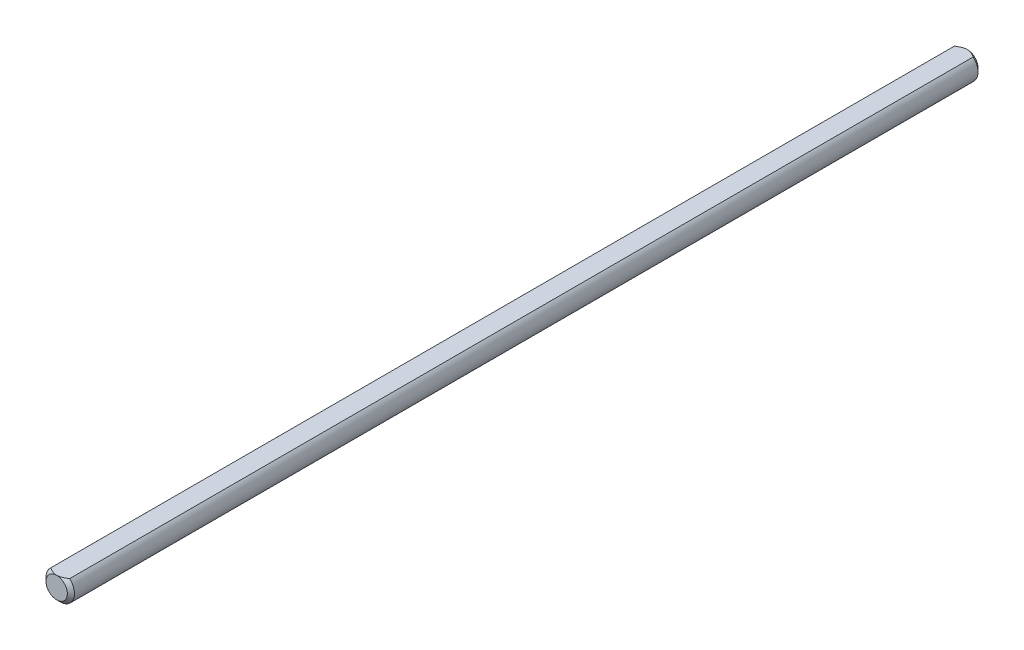
ISO-10303-21;
HEADER;
FILE_DESCRIPTION(('STEP AP214'),'2;1');
FILE_NAME('part.step','',(''),(''),'','','');
FILE_SCHEMA(('AUTOMOTIVE_DESIGN { 1 0 10303 214 1 1 1 1 }'));
ENDSEC;
DATA;
#1=APPLICATION_CONTEXT('core data for automotive mechanical design processes');
#2=APPLICATION_PROTOCOL_DEFINITION('international standard','automotive_design',2000,#1);
#3=PRODUCT_CONTEXT('',#1,'mechanical');
#4=PRODUCT('Part','Part','',(#3));
#5=PRODUCT_RELATED_PRODUCT_CATEGORY('part','',(#4));
#6=PRODUCT_DEFINITION_FORMATION('','',#4);
#7=PRODUCT_DEFINITION_CONTEXT('part definition',#1,'design');
#8=PRODUCT_DEFINITION('design','',#6,#7);
#9=PRODUCT_DEFINITION_SHAPE('','',#8);
#10=(LENGTH_UNIT() NAMED_UNIT(*) SI_UNIT(.MILLI.,.METRE.));
#11=(NAMED_UNIT(*) PLANE_ANGLE_UNIT() SI_UNIT($,.RADIAN.));
#12=(NAMED_UNIT(*) SI_UNIT($,.STERADIAN.) SOLID_ANGLE_UNIT());
#13=UNCERTAINTY_MEASURE_WITH_UNIT(LENGTH_MEASURE(1.E-05),#10,'distance_accuracy_value','');
#14=(GEOMETRIC_REPRESENTATION_CONTEXT(3) GLOBAL_UNCERTAINTY_ASSIGNED_CONTEXT((#13)) GLOBAL_UNIT_ASSIGNED_CONTEXT((#10,
#11,#12)) REPRESENTATION_CONTEXT('',''));
#15=CARTESIAN_POINT('',(0.,0.,0.));
#16=DIRECTION('',(0.,0.,1.));
#17=DIRECTION('',(1.,0.,0.));
#18=AXIS2_PLACEMENT_3D('',#15,#16,#17);
#19=CARTESIAN_POINT('',(0.,0.,64.));
#20=DIRECTION('',(0.,0.,1.));
#21=DIRECTION('',(1.,0.,0.));
#22=AXIS2_PLACEMENT_3D('',#19,#20,#21);
#23=PLANE('',#22);
#24=CARTESIAN_POINT('',(0.,0.,64.0000000000782));
#25=DIRECTION('',(0.,0.,-1.));
#26=DIRECTION('',(-1.,0.,0.));
#27=AXIS2_PLACEMENT_3D('',#24,#25,#26);
#28=CIRCLE('',#27,1.49999999996453);
#29=CARTESIAN_POINT('',(0.,1.49999999998227,64.0000000000605));
#30=VERTEX_POINT('',#29);
#31=EDGE_CURVE('E56',#30,#30,#28,.T.);
#32=ORIENTED_EDGE('',*,*,#31,.F.);
#33=EDGE_LOOP('',(#32));
#34=FACE_BOUND('',#33,.T.);
#35=ADVANCED_FACE('F23',(#34),#23,.T.);
#36=CARTESIAN_POINT('',(2.5,1.5,64.));
#37=DIRECTION('',(0.,-1.,0.));
#38=DIRECTION('',(1.,0.,0.));
#39=AXIS2_PLACEMENT_3D('',#36,#37,#38);
#40=PLANE('',#39);
#41=CARTESIAN_POINT('',(-1.32287565551578,1.49999999999738,-63.4999999999951));
#42=CARTESIAN_POINT('',(-1.28978652610646,1.49999999999903,-63.5218833857498));
#43=CARTESIAN_POINT('',(-1.25648829908703,1.49999999999974,-63.5434496498503));
#44=CARTESIAN_POINT('',(-1.18940821725078,1.50000000000027,-63.5858385594043));
#45=CARTESIAN_POINT('',(-1.15562621828719,1.50000000000009,-63.6066609764761));
#46=CARTESIAN_POINT('',(-1.05313237354557,1.49999999999981,-63.6680407619906));
#47=CARTESIAN_POINT('',(-0.983616016069132,1.49999999999995,-63.7072803573657));
#48=CARTESIAN_POINT('',(-0.844330882577105,1.50000000000005,-63.7796887527494));
#49=CARTESIAN_POINT('',(-0.774644168930951,1.50000000000001,-63.8130137248753));
#50=CARTESIAN_POINT('',(-0.63266148717882,1.49999999999999,-63.8733011447108));
#51=CARTESIAN_POINT('',(-0.560371516971381,1.5,-63.9002772585493));
#52=CARTESIAN_POINT('',(-0.447711355255382,1.5,-63.935050659113));
#53=CARTESIAN_POINT('',(-0.408281760393348,1.5,-63.945907415238));
#54=CARTESIAN_POINT('',(-0.328766084068122,1.5,-63.964879169649));
#55=CARTESIAN_POINT('',(-0.288680112515208,1.5,-63.9729946221418));
#56=CARTESIAN_POINT('',(-0.207337040739238,1.5,-63.9862763839511));
#57=CARTESIAN_POINT('',(-0.166071526804011,1.5,-63.9913918975337));
#58=CARTESIAN_POINT('',(-0.0832091080286585,1.5,-63.9982691223358));
#59=CARTESIAN_POINT('',(-0.0416118354953257,1.5,-64.0000263648933));
#60=CARTESIAN_POINT('',(-3.55771080674516E-13,1.5,-63.9999999999859));
#61=B_SPLINE_CURVE_WITH_KNOTS('',3,(#41,#42,#43,#44,#45,#46,#47,#48,#49,#50,#51,#52,#53,#54,#55,
#56,#57,#58,#59,#60),.UNSPECIFIED.,.F.,.F.,(4,2,2,2,2,2,2,2,2,4),(0.,0.119008015792597,
0.238052261697543,0.477379838947754,0.708907622242699,0.939932380506549,1.06254219803365,
1.18513169035164,1.30974106782519,1.43451614084083),.UNSPECIFIED.);
#62=CARTESIAN_POINT('',(-1.32287565549662,1.49999999999994,-63.5000000000332));
#63=VERTEX_POINT('',#62);
#64=CARTESIAN_POINT('',(0.,1.49999999998227,-64.0000000000036));
#65=VERTEX_POINT('',#64);
#66=EDGE_CURVE('E78',#63,#65,#61,.T.);
#67=ORIENTED_EDGE('',*,*,#66,.F.);
#68=DIRECTION('',(0.,0.,-1.));
#69=VECTOR('',#68,1.);
#70=CARTESIAN_POINT('',(-1.32287565553244,1.49999999999987,64.));
#71=LINE('',#70,#69);
#72=CARTESIAN_POINT('',(-1.32287565553959,1.49999999999994,63.500000000038));
#73=VERTEX_POINT('',#72);
#74=EDGE_CURVE('E61',#73,#63,#71,.T.);
#75=ORIENTED_EDGE('',*,*,#74,.F.);
#76=CARTESIAN_POINT('',(0.,1.5,64.0000000000427));
#77=CARTESIAN_POINT('',(-0.0461370153411529,1.5,64.0000386607632));
#78=CARTESIAN_POINT('',(-0.0922502054811612,1.5,63.9978722597996));
#79=CARTESIAN_POINT('',(-0.184012446607617,1.5,63.9894344398421));
#80=CARTESIAN_POINT('',(-0.229662229086193,1.5,63.9831710594516));
#81=CARTESIAN_POINT('',(-0.319483789254829,1.5,63.9669828571559));
#82=CARTESIAN_POINT('',(-0.363667480994457,1.5,63.9571229727286));
#83=CARTESIAN_POINT('',(-0.451194895226762,1.5,63.9341794397879));
#84=CARTESIAN_POINT('',(-0.494538298889039,1.5,63.9210945924866));
#85=CARTESIAN_POINT('',(-0.606395493958874,1.5,63.8833699128945));
#86=CARTESIAN_POINT('',(-0.674171065763848,1.5,63.8565447061939));
#87=CARTESIAN_POINT('',(-0.807413522300434,1.5,63.7975484095266));
#88=CARTESIAN_POINT('',(-0.87287679301136,1.5,63.7653693642463));
#89=CARTESIAN_POINT('',(-1.00366784629155,1.5,63.6960693225786));
#90=CARTESIAN_POINT('',(-1.06893080510649,1.5,63.6588276799585));
#91=CARTESIAN_POINT('',(-1.19733148576887,1.5,63.581392511705));
#92=CARTESIAN_POINT('',(-1.26047673772965,1.5,63.5412115385651));
#93=CARTESIAN_POINT('',(-1.32287565554666,1.5,63.5000000000333));
#94=B_SPLINE_CURVE_WITH_KNOTS('',3,(#76,#77,#78,#79,#80,#81,#82,#83,#84,#85,#86,#87,#88,#89,#90,
#91,#92,#93),.UNSPECIFIED.,.F.,.F.,(4,2,2,2,2,2,2,2,4),(0.,0.138322115291917,0.276373642272281,
0.412046847194119,0.547770561022349,0.76610941507743,0.984775646603529,1.21010028780345,
1.43451329840714),.UNSPECIFIED.);
#95=EDGE_CURVE('E26',#30,#73,#94,.T.);
#96=ORIENTED_EDGE('',*,*,#95,.F.);
#97=CARTESIAN_POINT('',(1.32287565554652,1.5,63.5000000000333));
#98=CARTESIAN_POINT('',(1.28978652613576,1.5,63.5218833857882));
#99=CARTESIAN_POINT('',(1.25648829911515,1.5,63.5434496498893));
#100=CARTESIAN_POINT('',(1.18940821727678,1.5,63.5858385594449));
#101=CARTESIAN_POINT('',(1.15562621831225,1.5,63.6066609765176));
#102=CARTESIAN_POINT('',(1.05313237356768,1.5,63.6680407620349));
#103=CARTESIAN_POINT('',(0.983616016089106,1.5,63.7072803574117));
#104=CARTESIAN_POINT('',(0.844330882592869,1.5,63.7796887527985));
#105=CARTESIAN_POINT('',(0.774644168944643,1.5,63.8130137249259));
#106=CARTESIAN_POINT('',(0.632661487188201,1.5,63.8733011447641));
#107=CARTESIAN_POINT('',(0.560371516978525,1.5,63.9002772586038));
#108=CARTESIAN_POINT('',(0.447711355259808,1.5,63.9350506591685));
#109=CARTESIAN_POINT('',(0.408281760397369,1.5,63.9459074152938));
#110=CARTESIAN_POINT('',(0.328766084071317,1.5,63.9648791697052));
#111=CARTESIAN_POINT('',(0.28868011251798,1.5,63.9729946221982));
#112=CARTESIAN_POINT('',(0.207337040741143,1.5,63.9862763840077));
#113=CARTESIAN_POINT('',(0.166071526805468,1.5,63.9913918975904));
#114=CARTESIAN_POINT('',(0.0832091080292139,1.5,63.9982691223926));
#115=CARTESIAN_POINT('',(0.0416118354954257,1.5,64.0000263649501));
#116=CARTESIAN_POINT('',(0.,1.5,64.0000000000427));
#117=B_SPLINE_CURVE_WITH_KNOTS('',3,(#97,#98,#99,#100,#101,#102,#103,#104,#105,#106,#107,#108,
#109,#110,#111,#112,#113,#114,#115,#116),.UNSPECIFIED.,.F.,.F.,(4,2,2,2,2,2,2,2,2,4),(0.,
0.119008015796507,0.238052261705375,0.477379838963609,0.708907622266096,0.939932380537412,
1.06254219806585,1.18513169038518,1.30974106786009,1.43451614087709),.UNSPECIFIED.);
#118=CARTESIAN_POINT('',(1.32287565553941,1.5,63.5000000000333));
#119=VERTEX_POINT('',#118);
#120=EDGE_CURVE('E96',#119,#30,#117,.T.);
#121=ORIENTED_EDGE('',*,*,#120,.F.);
#122=DIRECTION('',(0.,0.,-1.));
#123=VECTOR('',#122,1.);
#124=CARTESIAN_POINT('',(1.3228756555323,1.5,64.));
#125=LINE('',#124,#123);
#126=CARTESIAN_POINT('',(1.32287565549655,1.5,-63.5000000000332));
#127=VERTEX_POINT('',#126);
#128=EDGE_CURVE('E62',#127,#119,#125,.F.);
#129=ORIENTED_EDGE('',*,*,#128,.F.);
#130=CARTESIAN_POINT('',(0.,1.49999999999718,-63.9999999999847));
#131=CARTESIAN_POINT('',(0.0461370153412095,1.49999999999899,-64.000038660706));
#132=CARTESIAN_POINT('',(0.0922502054812524,1.49999999999973,-63.9978722597427));
#133=CARTESIAN_POINT('',(0.184012446607741,1.50000000000027,-63.9894344397853));
#134=CARTESIAN_POINT('',(0.229662229086316,1.50000000000007,-63.9831710593947));
#135=CARTESIAN_POINT('',(0.319483789254937,1.49999999999993,-63.966982857099));
#136=CARTESIAN_POINT('',(0.363667480994552,1.49999999999998,-63.9571229726718));
#137=CARTESIAN_POINT('',(0.451194895226837,1.50000000000002,-63.9341794397311));
#138=CARTESIAN_POINT('',(0.494538298889109,1.50000000000001,-63.9210945924297));
#139=CARTESIAN_POINT('',(0.606395493956133,1.49999999999999,-63.8833699128386));
#140=CARTESIAN_POINT('',(0.674171065758398,1.5,-63.8565447061392));
#141=CARTESIAN_POINT('',(0.807413522289736,1.5,-63.7975484094747));
#142=CARTESIAN_POINT('',(0.872876792998124,1.5,-63.765369364196));
#143=CARTESIAN_POINT('',(1.00366784627325,1.5,-63.6960693225318));
#144=CARTESIAN_POINT('',(1.06893080508566,1.5,-63.6588276799137));
#145=CARTESIAN_POINT('',(1.19733148574315,1.5,-63.5813925116642));
#146=CARTESIAN_POINT('',(1.26047673770156,1.5,-63.5412115385263));
#147=CARTESIAN_POINT('',(1.32287565551623,1.5,-63.4999999999965));
#148=B_SPLINE_CURVE_WITH_KNOTS('',3,(#130,#131,#132,#133,#134,#135,#136,#137,#138,#139,#140,
#141,#142,#143,#144,#145,#146,#147),.UNSPECIFIED.,.F.,.F.,(4,2,2,2,2,2,2,2,4),(0.,
0.138322115291979,0.276373642272356,0.412046847194152,0.547770561022358,0.766109415068569,
0.984775646585722,1.21010028777621,1.43451329837062),.UNSPECIFIED.);
#149=EDGE_CURVE('E68',#65,#127,#148,.T.);
#150=ORIENTED_EDGE('',*,*,#149,.F.);
#151=EDGE_LOOP('',(#67,#75,#96,#121,#129,#150));
#152=FACE_BOUND('',#151,.T.);
#153=ADVANCED_FACE('F82',(#152),#40,.F.);
#154=CARTESIAN_POINT('',(0.,0.,-64.));
#155=DIRECTION('',(0.,0.,1.));
#156=DIRECTION('',(1.,0.,0.));
#157=AXIS2_PLACEMENT_3D('',#154,#155,#156);
#158=PLANE('',#157);
#159=CARTESIAN_POINT('',(0.,0.,-64.0000000000214));
#160=DIRECTION('',(0.,0.,1.));
#161=DIRECTION('',(1.,0.,0.));
#162=AXIS2_PLACEMENT_3D('',#159,#160,#161);
#163=CIRCLE('',#162,1.49999999996453);
#164=EDGE_CURVE('E65',#65,#65,#163,.T.);
#165=ORIENTED_EDGE('',*,*,#164,.F.);
#166=EDGE_LOOP('',(#165));
#167=FACE_BOUND('',#166,.T.);
#168=ADVANCED_FACE('F94',(#167),#158,.F.);
#169=CARTESIAN_POINT('',(0.,0.,63.5000000001469));
#170=DIRECTION('',(0.,0.,-1.));
#171=DIRECTION('',(-1.,0.,0.));
#172=AXIS2_PLACEMENT_3D('',#169,#170,#171);
#173=CONICAL_SURFACE('',#172,1.99999999989586,0.785398163397448);
#174=ORIENTED_EDGE('',*,*,#31,.T.);
#175=ORIENTED_EDGE('',*,*,#95,.T.);
#176=CARTESIAN_POINT('',(0.,0.,63.5));
#177=DIRECTION('',(0.,0.,-1.));
#178=DIRECTION('',(-1.,0.,0.));
#179=AXIS2_PLACEMENT_3D('',#176,#177,#178);
#180=CIRCLE('',#179,2.);
#181=EDGE_CURVE('E36',#119,#73,#180,.T.);
#182=ORIENTED_EDGE('',*,*,#181,.F.);
#183=ORIENTED_EDGE('',*,*,#120,.T.);
#184=EDGE_LOOP('',(#174,#175,#182,#183));
#185=FACE_BOUND('',#184,.T.);
#186=ADVANCED_FACE('F90',(#185),#173,.T.);
#187=CARTESIAN_POINT('',(0.,0.,-63.50000000009));
#188=DIRECTION('',(0.,0.,1.));
#189=DIRECTION('',(1.,0.,0.));
#190=AXIS2_PLACEMENT_3D('',#187,#188,#189);
#191=CONICAL_SURFACE('',#190,1.99999999989586,0.785398163397448);
#192=ORIENTED_EDGE('',*,*,#164,.T.);
#193=ORIENTED_EDGE('',*,*,#149,.T.);
#194=CARTESIAN_POINT('',(0.,0.,-63.5));
#195=DIRECTION('',(0.,0.,-1.));
#196=DIRECTION('',(-1.,0.,0.));
#197=AXIS2_PLACEMENT_3D('',#194,#195,#196);
#198=CIRCLE('',#197,2.);
#199=EDGE_CURVE('E13',#63,#127,#198,.F.);
#200=ORIENTED_EDGE('',*,*,#199,.F.);
#201=ORIENTED_EDGE('',*,*,#66,.T.);
#202=EDGE_LOOP('',(#192,#193,#200,#201));
#203=FACE_BOUND('',#202,.T.);
#204=ADVANCED_FACE('F85',(#203),#191,.T.);
#205=CARTESIAN_POINT('',(0.,0.,64.));
#206=DIRECTION('',(0.,0.,-1.));
#207=DIRECTION('',(-1.,0.,0.));
#208=AXIS2_PLACEMENT_3D('',#205,#206,#207);
#209=CYLINDRICAL_SURFACE('',#208,2.);
#210=ORIENTED_EDGE('',*,*,#181,.T.);
#211=ORIENTED_EDGE('',*,*,#74,.T.);
#212=ORIENTED_EDGE('',*,*,#199,.T.);
#213=ORIENTED_EDGE('',*,*,#128,.T.);
#214=EDGE_LOOP('',(#210,#211,#212,#213));
#215=FACE_BOUND('',#214,.T.);
#216=ADVANCED_FACE('F89',(#215),#209,.T.);
#217=CLOSED_SHELL('',(#35,#153,#168,#186,#204,#216));
#218=MANIFOLD_SOLID_BREP('B1',#217);
#219=ADVANCED_BREP_SHAPE_REPRESENTATION('',(#18,#218),#14);
#220=SHAPE_DEFINITION_REPRESENTATION(#9,#219);
ENDSEC;
END-ISO-10303-21;
